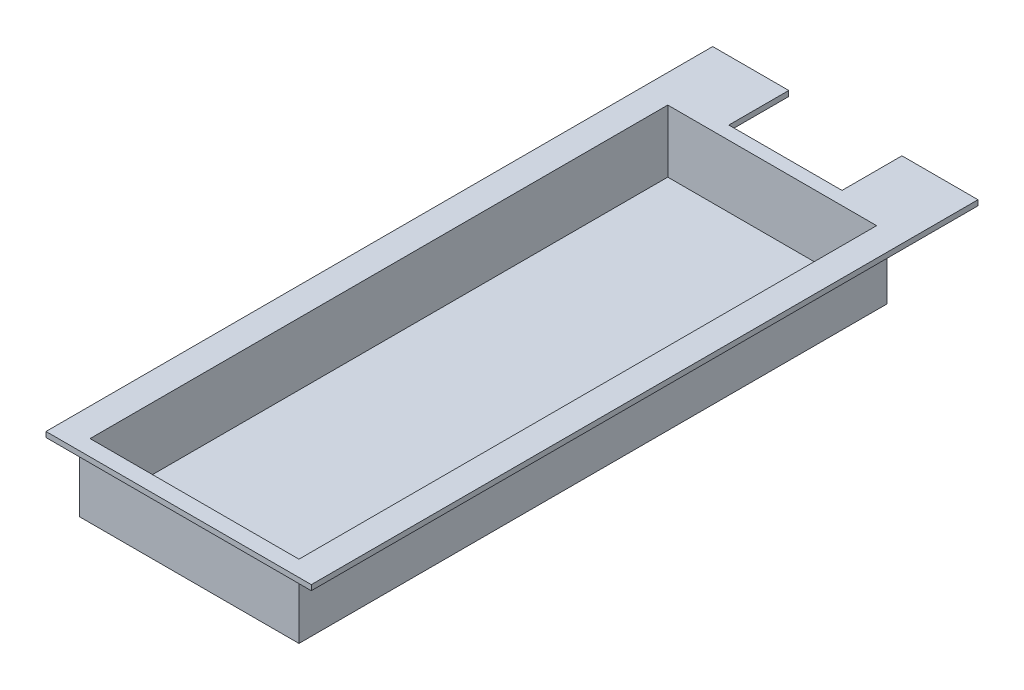
ISO-10303-21;
HEADER;
FILE_DESCRIPTION(('STEP AP214'),'2;1');
FILE_NAME('part.step','',(''),(''),'','','');
FILE_SCHEMA(('AUTOMOTIVE_DESIGN { 1 0 10303 214 1 1 1 1 }'));
ENDSEC;
DATA;
#1=APPLICATION_CONTEXT('core data for automotive mechanical design processes');
#2=APPLICATION_PROTOCOL_DEFINITION('international standard','automotive_design',2000,#1);
#3=PRODUCT_CONTEXT('',#1,'mechanical');
#4=PRODUCT('Part','Part','',(#3));
#5=PRODUCT_RELATED_PRODUCT_CATEGORY('part','',(#4));
#6=PRODUCT_DEFINITION_FORMATION('','',#4);
#7=PRODUCT_DEFINITION_CONTEXT('part definition',#1,'design');
#8=PRODUCT_DEFINITION('design','',#6,#7);
#9=PRODUCT_DEFINITION_SHAPE('','',#8);
#10=(LENGTH_UNIT() NAMED_UNIT(*) SI_UNIT(.MILLI.,.METRE.));
#11=(NAMED_UNIT(*) PLANE_ANGLE_UNIT() SI_UNIT($,.RADIAN.));
#12=(NAMED_UNIT(*) SI_UNIT($,.STERADIAN.) SOLID_ANGLE_UNIT());
#13=UNCERTAINTY_MEASURE_WITH_UNIT(LENGTH_MEASURE(1.E-05),#10,'distance_accuracy_value','');
#14=(GEOMETRIC_REPRESENTATION_CONTEXT(3) GLOBAL_UNCERTAINTY_ASSIGNED_CONTEXT((#13)) GLOBAL_UNIT_ASSIGNED_CONTEXT((#10,
#11,#12)) REPRESENTATION_CONTEXT('',''));
#15=CARTESIAN_POINT('',(0.,0.,0.));
#16=DIRECTION('',(0.,0.,1.));
#17=DIRECTION('',(1.,0.,0.));
#18=AXIS2_PLACEMENT_3D('',#15,#16,#17);
#19=CARTESIAN_POINT('',(0.,35.4,-118.746556797035));
#20=DIRECTION('',(0.,0.,-1.));
#21=DIRECTION('',(-1.,0.,0.));
#22=AXIS2_PLACEMENT_3D('',#19,#20,#21);
#23=PLANE('',#22);
#24=DIRECTION('',(1.,0.,0.));
#25=VECTOR('',#24,1.);
#26=CARTESIAN_POINT('',(0.,0.,-118.746556797035));
#27=LINE('',#26,#25);
#28=CARTESIAN_POINT('',(66.8696460176992,0.,-118.746556797035));
#29=VERTEX_POINT('',#28);
#30=CARTESIAN_POINT('',(185.329646017699,0.,-118.746556797035));
#31=VERTEX_POINT('',#30);
#32=EDGE_CURVE('E230',#29,#31,#27,.T.);
#33=ORIENTED_EDGE('',*,*,#32,.T.);
#34=DIRECTION('',(0.,-1.,0.));
#35=VECTOR('',#34,1.);
#36=CARTESIAN_POINT('',(185.329646017699,35.4,-118.746556797035));
#37=LINE('',#36,#35);
#38=CARTESIAN_POINT('',(185.329646017699,35.4,-118.746556797035));
#39=VERTEX_POINT('',#38);
#40=EDGE_CURVE('E270',#39,#31,#37,.T.);
#41=ORIENTED_EDGE('',*,*,#40,.F.);
#42=DIRECTION('',(1.,0.,0.));
#43=VECTOR('',#42,1.);
#44=CARTESIAN_POINT('',(0.,35.4,-118.746556797035));
#45=LINE('',#44,#43);
#46=CARTESIAN_POINT('',(66.8696460176992,35.4,-118.746556797035));
#47=VERTEX_POINT('',#46);
#48=EDGE_CURVE('E243',#47,#39,#45,.T.);
#49=ORIENTED_EDGE('',*,*,#48,.F.);
#50=DIRECTION('',(0.,-1.,0.));
#51=VECTOR('',#50,1.);
#52=CARTESIAN_POINT('',(66.8696460176992,35.4,-118.746556797035));
#53=LINE('',#52,#51);
#54=EDGE_CURVE('E255',#47,#29,#53,.T.);
#55=ORIENTED_EDGE('',*,*,#54,.T.);
#56=EDGE_LOOP('',(#33,#41,#49,#55));
#57=FACE_BOUND('',#56,.T.);
#58=ADVANCED_FACE('F47',(#57),#23,.F.);
#59=CARTESIAN_POINT('',(185.329646017699,35.4,0.));
#60=DIRECTION('',(1.,0.,0.));
#61=DIRECTION('',(0.,0.,-1.));
#62=AXIS2_PLACEMENT_3D('',#59,#60,#61);
#63=PLANE('',#62);
#64=DIRECTION('',(0.,0.,1.));
#65=VECTOR('',#64,1.);
#66=CARTESIAN_POINT('',(185.329646017699,0.,0.));
#67=LINE('',#66,#65);
#68=CARTESIAN_POINT('',(185.329646017699,0.,208.87348694907));
#69=VERTEX_POINT('',#68);
#70=EDGE_CURVE('E72',#31,#69,#67,.T.);
#71=ORIENTED_EDGE('',*,*,#70,.T.);
#72=DIRECTION('',(0.,-1.,0.));
#73=VECTOR('',#72,1.);
#74=CARTESIAN_POINT('',(185.329646017699,35.4,208.87348694907));
#75=LINE('',#74,#73);
#76=CARTESIAN_POINT('',(185.329646017699,35.4,208.87348694907));
#77=VERTEX_POINT('',#76);
#78=EDGE_CURVE('E267',#77,#69,#75,.T.);
#79=ORIENTED_EDGE('',*,*,#78,.F.);
#80=DIRECTION('',(0.,0.,1.));
#81=VECTOR('',#80,1.);
#82=CARTESIAN_POINT('',(185.329646017699,35.4,0.));
#83=LINE('',#82,#81);
#84=EDGE_CURVE('E246',#39,#77,#83,.T.);
#85=ORIENTED_EDGE('',*,*,#84,.F.);
#86=ORIENTED_EDGE('',*,*,#40,.T.);
#87=EDGE_LOOP('',(#71,#79,#85,#86));
#88=FACE_BOUND('',#87,.T.);
#89=ADVANCED_FACE('F312',(#88),#63,.F.);
#90=CARTESIAN_POINT('',(0.,35.4,208.87348694907));
#91=DIRECTION('',(0.,0.,-1.));
#92=DIRECTION('',(-1.,0.,0.));
#93=AXIS2_PLACEMENT_3D('',#90,#91,#92);
#94=PLANE('',#93);
#95=DIRECTION('',(1.,0.,0.));
#96=VECTOR('',#95,1.);
#97=CARTESIAN_POINT('',(0.,0.,208.87348694907));
#98=LINE('',#97,#96);
#99=CARTESIAN_POINT('',(66.8696460176992,0.,208.87348694907));
#100=VERTEX_POINT('',#99);
#101=EDGE_CURVE('E259',#100,#69,#98,.T.);
#102=ORIENTED_EDGE('',*,*,#101,.F.);
#103=DIRECTION('',(0.,-1.,0.));
#104=VECTOR('',#103,1.);
#105=CARTESIAN_POINT('',(66.8696460176992,35.4,208.87348694907));
#106=LINE('',#105,#104);
#107=CARTESIAN_POINT('',(66.8696460176992,35.4,208.87348694907));
#108=VERTEX_POINT('',#107);
#109=EDGE_CURVE('E264',#108,#100,#106,.T.);
#110=ORIENTED_EDGE('',*,*,#109,.F.);
#111=DIRECTION('',(1.,0.,0.));
#112=VECTOR('',#111,1.);
#113=CARTESIAN_POINT('',(0.,35.4,208.87348694907));
#114=LINE('',#113,#112);
#115=EDGE_CURVE('E249',#108,#77,#114,.T.);
#116=ORIENTED_EDGE('',*,*,#115,.T.);
#117=ORIENTED_EDGE('',*,*,#78,.T.);
#118=EDGE_LOOP('',(#102,#110,#116,#117));
#119=FACE_BOUND('',#118,.T.);
#120=ADVANCED_FACE('F319',(#119),#94,.T.);
#121=CARTESIAN_POINT('',(66.8696460176992,35.4,0.));
#122=DIRECTION('',(1.,0.,0.));
#123=DIRECTION('',(0.,0.,-1.));
#124=AXIS2_PLACEMENT_3D('',#121,#122,#123);
#125=PLANE('',#124);
#126=DIRECTION('',(0.,0.,1.));
#127=VECTOR('',#126,1.);
#128=CARTESIAN_POINT('',(66.8696460176992,0.,0.));
#129=LINE('',#128,#127);
#130=EDGE_CURVE('E247',#29,#100,#129,.T.);
#131=ORIENTED_EDGE('',*,*,#130,.F.);
#132=ORIENTED_EDGE('',*,*,#54,.F.);
#133=DIRECTION('',(0.,0.,1.));
#134=VECTOR('',#133,1.);
#135=CARTESIAN_POINT('',(66.8696460176992,35.4,0.));
#136=LINE('',#135,#134);
#137=EDGE_CURVE('E252',#47,#108,#136,.T.);
#138=ORIENTED_EDGE('',*,*,#137,.T.);
#139=ORIENTED_EDGE('',*,*,#109,.T.);
#140=EDGE_LOOP('',(#131,#132,#138,#139));
#141=FACE_BOUND('',#140,.T.);
#142=ADVANCED_FACE('F334',(#141),#125,.T.);
#143=CARTESIAN_POINT('',(0.,35.4,0.));
#144=DIRECTION('',(0.,1.,0.));
#145=DIRECTION('',(0.,0.,1.));
#146=AXIS2_PLACEMENT_3D('',#143,#144,#145);
#147=PLANE('',#146);
#148=ORIENTED_EDGE('',*,*,#48,.T.);
#149=ORIENTED_EDGE('',*,*,#84,.T.);
#150=ORIENTED_EDGE('',*,*,#115,.F.);
#151=ORIENTED_EDGE('',*,*,#137,.F.);
#152=EDGE_LOOP('',(#148,#149,#150,#151));
#153=FACE_BOUND('',#152,.T.);
#154=DIRECTION('',(0.,0.,1.));
#155=VECTOR('',#154,1.);
#156=CARTESIAN_POINT('',(201.329646017699,35.4,0.));
#157=LINE('',#156,#155);
#158=CARTESIAN_POINT('',(201.329646017699,35.4,-160.232979164548));
#159=VERTEX_POINT('',#158);
#160=CARTESIAN_POINT('',(201.329646017699,35.4,217.87348694907));
#161=VERTEX_POINT('',#160);
#162=EDGE_CURVE('E213',#159,#161,#157,.T.);
#163=ORIENTED_EDGE('',*,*,#162,.F.);
#164=DIRECTION('',(1.,0.,0.));
#165=VECTOR('',#164,1.);
#166=CARTESIAN_POINT('',(0.,35.4,-160.232979164548));
#167=LINE('',#166,#165);
#168=CARTESIAN_POINT('',(158.199646017699,35.4,-160.232979164548));
#169=VERTEX_POINT('',#168);
#170=EDGE_CURVE('E178',#169,#159,#167,.T.);
#171=ORIENTED_EDGE('',*,*,#170,.F.);
#172=DIRECTION('',(0.,0.,1.));
#173=VECTOR('',#172,1.);
#174=CARTESIAN_POINT('',(158.199646017699,35.4,0.));
#175=LINE('',#174,#173);
#176=CARTESIAN_POINT('',(158.199646017699,35.4,-126.246556797035));
#177=VERTEX_POINT('',#176);
#178=EDGE_CURVE('E216',#169,#177,#175,.T.);
#179=ORIENTED_EDGE('',*,*,#178,.T.);
#180=DIRECTION('',(-1.,0.,0.));
#181=VECTOR('',#180,1.);
#182=CARTESIAN_POINT('',(0.,35.4,-126.246556797035));
#183=LINE('',#182,#181);
#184=CARTESIAN_POINT('',(93.9996460176992,35.4,-126.246556797035));
#185=VERTEX_POINT('',#184);
#186=EDGE_CURVE('E219',#177,#185,#183,.T.);
#187=ORIENTED_EDGE('',*,*,#186,.T.);
#188=DIRECTION('',(0.,0.,1.));
#189=VECTOR('',#188,1.);
#190=CARTESIAN_POINT('',(93.999646017699,35.4,0.));
#191=LINE('',#190,#189);
#192=CARTESIAN_POINT('',(93.9996460176992,35.4,-160.232979164548));
#193=VERTEX_POINT('',#192);
#194=EDGE_CURVE('E222',#193,#185,#191,.T.);
#195=ORIENTED_EDGE('',*,*,#194,.F.);
#196=DIRECTION('',(1.,0.,0.));
#197=VECTOR('',#196,1.);
#198=CARTESIAN_POINT('',(0.,35.4,-160.232979164548));
#199=LINE('',#198,#197);
#200=CARTESIAN_POINT('',(50.8696460176992,35.4,-160.232979164548));
#201=VERTEX_POINT('',#200);
#202=EDGE_CURVE('E225',#201,#193,#199,.T.);
#203=ORIENTED_EDGE('',*,*,#202,.F.);
#204=DIRECTION('',(0.,0.,1.));
#205=VECTOR('',#204,1.);
#206=CARTESIAN_POINT('',(50.8696460176992,35.4,0.));
#207=LINE('',#206,#205);
#208=CARTESIAN_POINT('',(50.8696460176992,35.4,217.87348694907));
#209=VERTEX_POINT('',#208);
#210=EDGE_CURVE('E190',#201,#209,#207,.T.);
#211=ORIENTED_EDGE('',*,*,#210,.T.);
#212=DIRECTION('',(1.,0.,0.));
#213=VECTOR('',#212,1.);
#214=CARTESIAN_POINT('',(0.,35.4,217.87348694907));
#215=LINE('',#214,#213);
#216=EDGE_CURVE('E187',#209,#161,#215,.T.);
#217=ORIENTED_EDGE('',*,*,#216,.T.);
#218=EDGE_LOOP('',(#163,#171,#179,#187,#195,#203,#211,#217));
#219=FACE_BOUND('',#218,.T.);
#220=ADVANCED_FACE('F326',(#153,#219),#147,.T.);
#221=CARTESIAN_POINT('',(0.,0.,0.));
#222=DIRECTION('',(0.,1.,0.));
#223=DIRECTION('',(0.,0.,1.));
#224=AXIS2_PLACEMENT_3D('',#221,#222,#223);
#225=PLANE('',#224);
#226=ORIENTED_EDGE('',*,*,#70,.F.);
#227=ORIENTED_EDGE('',*,*,#32,.F.);
#228=ORIENTED_EDGE('',*,*,#130,.T.);
#229=ORIENTED_EDGE('',*,*,#101,.T.);
#230=EDGE_LOOP('',(#226,#227,#228,#229));
#231=FACE_BOUND('',#230,.T.);
#232=ADVANCED_FACE('F324',(#231),#225,.T.);
#233=CARTESIAN_POINT('',(201.329646017699,32.4,0.));
#234=DIRECTION('',(-1.,0.,0.));
#235=DIRECTION('',(0.,0.,1.));
#236=AXIS2_PLACEMENT_3D('',#233,#234,#235);
#237=PLANE('',#236);
#238=ORIENTED_EDGE('',*,*,#162,.T.);
#239=DIRECTION('',(0.,1.,0.));
#240=VECTOR('',#239,1.);
#241=CARTESIAN_POINT('',(201.329646017699,32.4,217.87348694907));
#242=LINE('',#241,#240);
#243=CARTESIAN_POINT('',(201.329646017699,32.4,217.87348694907));
#244=VERTEX_POINT('',#243);
#245=EDGE_CURVE('E185',#244,#161,#242,.T.);
#246=ORIENTED_EDGE('',*,*,#245,.F.);
#247=DIRECTION('',(0.,0.,1.));
#248=VECTOR('',#247,1.);
#249=CARTESIAN_POINT('',(201.329646017699,32.4,0.));
#250=LINE('',#249,#248);
#251=CARTESIAN_POINT('',(201.329646017699,32.4,-160.232979164548));
#252=VERTEX_POINT('',#251);
#253=EDGE_CURVE('E167',#252,#244,#250,.T.);
#254=ORIENTED_EDGE('',*,*,#253,.F.);
#255=DIRECTION('',(0.,1.,0.));
#256=VECTOR('',#255,1.);
#257=CARTESIAN_POINT('',(201.329646017699,32.4,-160.232979164548));
#258=LINE('',#257,#256);
#259=EDGE_CURVE('E175',#252,#159,#258,.T.);
#260=ORIENTED_EDGE('',*,*,#259,.T.);
#261=EDGE_LOOP('',(#238,#246,#254,#260));
#262=FACE_BOUND('',#261,.T.);
#263=ADVANCED_FACE('F184',(#262),#237,.F.);
#264=CARTESIAN_POINT('',(0.,32.4,217.87348694907));
#265=DIRECTION('',(0.,0.,1.));
#266=DIRECTION('',(1.,0.,0.));
#267=AXIS2_PLACEMENT_3D('',#264,#265,#266);
#268=PLANE('',#267);
#269=ORIENTED_EDGE('',*,*,#216,.F.);
#270=DIRECTION('',(0.,1.,0.));
#271=VECTOR('',#270,1.);
#272=CARTESIAN_POINT('',(50.8696460176992,32.4,217.87348694907));
#273=LINE('',#272,#271);
#274=CARTESIAN_POINT('',(50.8696460176992,32.4,217.87348694907));
#275=VERTEX_POINT('',#274);
#276=EDGE_CURVE('E231',#275,#209,#273,.T.);
#277=ORIENTED_EDGE('',*,*,#276,.F.);
#278=DIRECTION('',(1.,0.,0.));
#279=VECTOR('',#278,1.);
#280=CARTESIAN_POINT('',(0.,32.4,217.87348694907));
#281=LINE('',#280,#279);
#282=EDGE_CURVE('E204',#275,#244,#281,.T.);
#283=ORIENTED_EDGE('',*,*,#282,.T.);
#284=ORIENTED_EDGE('',*,*,#245,.T.);
#285=EDGE_LOOP('',(#269,#277,#283,#284));
#286=FACE_BOUND('',#285,.T.);
#287=ADVANCED_FACE('F332',(#286),#268,.T.);
#288=CARTESIAN_POINT('',(50.8696460176992,32.4,0.));
#289=DIRECTION('',(-1.,0.,0.));
#290=DIRECTION('',(0.,0.,1.));
#291=AXIS2_PLACEMENT_3D('',#288,#289,#290);
#292=PLANE('',#291);
#293=ORIENTED_EDGE('',*,*,#210,.F.);
#294=DIRECTION('',(0.,1.,0.));
#295=VECTOR('',#294,1.);
#296=CARTESIAN_POINT('',(50.8696460176992,32.4,-160.232979164548));
#297=LINE('',#296,#295);
#298=CARTESIAN_POINT('',(50.8696460176992,32.4,-160.232979164548));
#299=VERTEX_POINT('',#298);
#300=EDGE_CURVE('E233',#299,#201,#297,.T.);
#301=ORIENTED_EDGE('',*,*,#300,.F.);
#302=DIRECTION('',(0.,0.,1.));
#303=VECTOR('',#302,1.);
#304=CARTESIAN_POINT('',(50.8696460176992,32.4,0.));
#305=LINE('',#304,#303);
#306=EDGE_CURVE('E201',#299,#275,#305,.T.);
#307=ORIENTED_EDGE('',*,*,#306,.T.);
#308=ORIENTED_EDGE('',*,*,#276,.T.);
#309=EDGE_LOOP('',(#293,#301,#307,#308));
#310=FACE_BOUND('',#309,.T.);
#311=ADVANCED_FACE('F440',(#310),#292,.T.);
#312=CARTESIAN_POINT('',(0.,32.4,-160.232979164548));
#313=DIRECTION('',(0.,0.,1.));
#314=DIRECTION('',(1.,0.,0.));
#315=AXIS2_PLACEMENT_3D('',#312,#313,#314);
#316=PLANE('',#315);
#317=ORIENTED_EDGE('',*,*,#202,.T.);
#318=DIRECTION('',(0.,1.,0.));
#319=VECTOR('',#318,1.);
#320=CARTESIAN_POINT('',(93.9996460176992,32.4,-160.232979164548));
#321=LINE('',#320,#319);
#322=CARTESIAN_POINT('',(93.9996460176992,32.4,-160.232979164548));
#323=VERTEX_POINT('',#322);
#324=EDGE_CURVE('E235',#323,#193,#321,.T.);
#325=ORIENTED_EDGE('',*,*,#324,.F.);
#326=DIRECTION('',(1.,0.,0.));
#327=VECTOR('',#326,1.);
#328=CARTESIAN_POINT('',(0.,32.4,-160.232979164548));
#329=LINE('',#328,#327);
#330=EDGE_CURVE('E199',#299,#323,#329,.T.);
#331=ORIENTED_EDGE('',*,*,#330,.F.);
#332=ORIENTED_EDGE('',*,*,#300,.T.);
#333=EDGE_LOOP('',(#317,#325,#331,#332));
#334=FACE_BOUND('',#333,.T.);
#335=ADVANCED_FACE('F450',(#334),#316,.F.);
#336=CARTESIAN_POINT('',(93.999646017699,32.4,0.));
#337=DIRECTION('',(-1.,0.,0.));
#338=DIRECTION('',(0.,0.,1.));
#339=AXIS2_PLACEMENT_3D('',#336,#337,#338);
#340=PLANE('',#339);
#341=ORIENTED_EDGE('',*,*,#194,.T.);
#342=DIRECTION('',(0.,1.,0.));
#343=VECTOR('',#342,1.);
#344=CARTESIAN_POINT('',(93.9996460176992,32.4,-126.246556797035));
#345=LINE('',#344,#343);
#346=CARTESIAN_POINT('',(93.9996460176992,32.4,-126.246556797035));
#347=VERTEX_POINT('',#346);
#348=EDGE_CURVE('E238',#347,#185,#345,.T.);
#349=ORIENTED_EDGE('',*,*,#348,.F.);
#350=DIRECTION('',(0.,0.,1.));
#351=VECTOR('',#350,1.);
#352=CARTESIAN_POINT('',(93.999646017699,32.4,0.));
#353=LINE('',#352,#351);
#354=EDGE_CURVE('E197',#323,#347,#353,.T.);
#355=ORIENTED_EDGE('',*,*,#354,.F.);
#356=ORIENTED_EDGE('',*,*,#324,.T.);
#357=EDGE_LOOP('',(#341,#349,#355,#356));
#358=FACE_BOUND('',#357,.T.);
#359=ADVANCED_FACE('F460',(#358),#340,.F.);
#360=CARTESIAN_POINT('',(0.,32.4,-126.246556797035));
#361=DIRECTION('',(0.,0.,-1.));
#362=DIRECTION('',(-1.,0.,0.));
#363=AXIS2_PLACEMENT_3D('',#360,#361,#362);
#364=PLANE('',#363);
#365=ORIENTED_EDGE('',*,*,#186,.F.);
#366=DIRECTION('',(0.,1.,0.));
#367=VECTOR('',#366,1.);
#368=CARTESIAN_POINT('',(158.199646017699,32.4,-126.246556797035));
#369=LINE('',#368,#367);
#370=CARTESIAN_POINT('',(158.199646017699,32.4,-126.246556797035));
#371=VERTEX_POINT('',#370);
#372=EDGE_CURVE('E240',#371,#177,#369,.T.);
#373=ORIENTED_EDGE('',*,*,#372,.F.);
#374=DIRECTION('',(-1.,0.,0.));
#375=VECTOR('',#374,1.);
#376=CARTESIAN_POINT('',(0.,32.4,-126.246556797035));
#377=LINE('',#376,#375);
#378=EDGE_CURVE('E194',#371,#347,#377,.T.);
#379=ORIENTED_EDGE('',*,*,#378,.T.);
#380=ORIENTED_EDGE('',*,*,#348,.T.);
#381=EDGE_LOOP('',(#365,#373,#379,#380));
#382=FACE_BOUND('',#381,.T.);
#383=ADVANCED_FACE('F470',(#382),#364,.T.);
#384=CARTESIAN_POINT('',(158.199646017699,32.4,0.));
#385=DIRECTION('',(-1.,0.,0.));
#386=DIRECTION('',(0.,0.,1.));
#387=AXIS2_PLACEMENT_3D('',#384,#385,#386);
#388=PLANE('',#387);
#389=ORIENTED_EDGE('',*,*,#178,.F.);
#390=DIRECTION('',(0.,1.,0.));
#391=VECTOR('',#390,1.);
#392=CARTESIAN_POINT('',(158.199646017699,32.4,-160.232979164548));
#393=LINE('',#392,#391);
#394=CARTESIAN_POINT('',(158.199646017699,32.4,-160.232979164548));
#395=VERTEX_POINT('',#394);
#396=EDGE_CURVE('E182',#395,#169,#393,.T.);
#397=ORIENTED_EDGE('',*,*,#396,.F.);
#398=DIRECTION('',(0.,0.,1.));
#399=VECTOR('',#398,1.);
#400=CARTESIAN_POINT('',(158.199646017699,32.4,0.));
#401=LINE('',#400,#399);
#402=EDGE_CURVE('E171',#395,#371,#401,.T.);
#403=ORIENTED_EDGE('',*,*,#402,.T.);
#404=ORIENTED_EDGE('',*,*,#372,.T.);
#405=EDGE_LOOP('',(#389,#397,#403,#404));
#406=FACE_BOUND('',#405,.T.);
#407=ADVANCED_FACE('F481',(#406),#388,.T.);
#408=CARTESIAN_POINT('',(0.,32.4,-160.232979164548));
#409=DIRECTION('',(0.,0.,1.));
#410=DIRECTION('',(1.,0.,0.));
#411=AXIS2_PLACEMENT_3D('',#408,#409,#410);
#412=PLANE('',#411);
#413=ORIENTED_EDGE('',*,*,#170,.T.);
#414=ORIENTED_EDGE('',*,*,#259,.F.);
#415=DIRECTION('',(1.,0.,0.));
#416=VECTOR('',#415,1.);
#417=CARTESIAN_POINT('',(0.,32.4,-160.232979164548));
#418=LINE('',#417,#416);
#419=EDGE_CURVE('E162',#395,#252,#418,.T.);
#420=ORIENTED_EDGE('',*,*,#419,.F.);
#421=ORIENTED_EDGE('',*,*,#396,.T.);
#422=EDGE_LOOP('',(#413,#414,#420,#421));
#423=FACE_BOUND('',#422,.T.);
#424=ADVANCED_FACE('F176',(#423),#412,.F.);
#425=CARTESIAN_POINT('',(0.,32.4,0.));
#426=DIRECTION('',(0.,1.,0.));
#427=DIRECTION('',(0.,0.,1.));
#428=AXIS2_PLACEMENT_3D('',#425,#426,#427);
#429=PLANE('',#428);
#430=ORIENTED_EDGE('',*,*,#253,.T.);
#431=ORIENTED_EDGE('',*,*,#282,.F.);
#432=ORIENTED_EDGE('',*,*,#306,.F.);
#433=ORIENTED_EDGE('',*,*,#330,.T.);
#434=ORIENTED_EDGE('',*,*,#354,.T.);
#435=ORIENTED_EDGE('',*,*,#378,.F.);
#436=ORIENTED_EDGE('',*,*,#402,.F.);
#437=ORIENTED_EDGE('',*,*,#419,.T.);
#438=EDGE_LOOP('',(#430,#431,#432,#433,#434,#435,#436,#437));
#439=FACE_BOUND('',#438,.T.);
#440=DIRECTION('',(1.,0.,0.));
#441=VECTOR('',#440,1.);
#442=CARTESIAN_POINT('',(0.,32.4,211.87348694907));
#443=LINE('',#442,#441);
#444=CARTESIAN_POINT('',(63.8696460176992,32.4,211.87348694907));
#445=VERTEX_POINT('',#444);
#446=CARTESIAN_POINT('',(188.329646017699,32.4,211.87348694907));
#447=VERTEX_POINT('',#446);
#448=EDGE_CURVE('E206',#445,#447,#443,.T.);
#449=ORIENTED_EDGE('',*,*,#448,.T.);
#450=DIRECTION('',(0.,0.,-1.));
#451=VECTOR('',#450,1.);
#452=CARTESIAN_POINT('',(188.329646017699,32.4,0.));
#453=LINE('',#452,#451);
#454=CARTESIAN_POINT('',(188.329646017699,32.4,-121.746556797035));
#455=VERTEX_POINT('',#454);
#456=EDGE_CURVE('E64',#447,#455,#453,.T.);
#457=ORIENTED_EDGE('',*,*,#456,.T.);
#458=DIRECTION('',(1.,0.,0.));
#459=VECTOR('',#458,1.);
#460=CARTESIAN_POINT('',(0.,32.4,-121.746556797035));
#461=LINE('',#460,#459);
#462=CARTESIAN_POINT('',(63.8696460176992,32.4,-121.746556797035));
#463=VERTEX_POINT('',#462);
#464=EDGE_CURVE('E210',#463,#455,#461,.T.);
#465=ORIENTED_EDGE('',*,*,#464,.F.);
#466=DIRECTION('',(0.,0.,1.));
#467=VECTOR('',#466,1.);
#468=CARTESIAN_POINT('',(63.8696460176992,32.4,0.));
#469=LINE('',#468,#467);
#470=EDGE_CURVE('E208',#463,#445,#469,.T.);
#471=ORIENTED_EDGE('',*,*,#470,.T.);
#472=EDGE_LOOP('',(#449,#457,#465,#471));
#473=FACE_BOUND('',#472,.T.);
#474=ADVANCED_FACE('F164',(#439,#473),#429,.F.);
#475=CARTESIAN_POINT('',(0.,-3.,0.));
#476=DIRECTION('',(0.,1.,0.));
#477=DIRECTION('',(0.,0.,1.));
#478=AXIS2_PLACEMENT_3D('',#475,#476,#477);
#479=PLANE('',#478);
#480=DIRECTION('',(0.,0.,-1.));
#481=VECTOR('',#480,1.);
#482=CARTESIAN_POINT('',(188.329646017699,-3.,-121.746556797035));
#483=LINE('',#482,#481);
#484=CARTESIAN_POINT('',(188.329646017699,-3.,211.87348694907));
#485=VERTEX_POINT('',#484);
#486=CARTESIAN_POINT('',(188.329646017699,-3.,-121.746556797035));
#487=VERTEX_POINT('',#486);
#488=EDGE_CURVE('E272',#485,#487,#483,.T.);
#489=ORIENTED_EDGE('',*,*,#488,.F.);
#490=DIRECTION('',(1.,0.,0.));
#491=VECTOR('',#490,1.);
#492=CARTESIAN_POINT('',(63.8696460176992,-3.,211.87348694907));
#493=LINE('',#492,#491);
#494=CARTESIAN_POINT('',(63.8696460176992,-3.,211.87348694907));
#495=VERTEX_POINT('',#494);
#496=EDGE_CURVE('E280',#495,#485,#493,.T.);
#497=ORIENTED_EDGE('',*,*,#496,.F.);
#498=DIRECTION('',(0.,0.,1.));
#499=VECTOR('',#498,1.);
#500=CARTESIAN_POINT('',(63.8696460176992,-3.,-121.746556797035));
#501=LINE('',#500,#499);
#502=CARTESIAN_POINT('',(63.8696460176992,-3.,-121.746556797035));
#503=VERTEX_POINT('',#502);
#504=EDGE_CURVE('E277',#503,#495,#501,.T.);
#505=ORIENTED_EDGE('',*,*,#504,.F.);
#506=DIRECTION('',(-1.,0.,0.));
#507=VECTOR('',#506,1.);
#508=CARTESIAN_POINT('',(164.199646017699,-3.,-121.746556797035));
#509=LINE('',#508,#507);
#510=EDGE_CURVE('E275',#487,#503,#509,.T.);
#511=ORIENTED_EDGE('',*,*,#510,.F.);
#512=EDGE_LOOP('',(#489,#497,#505,#511));
#513=FACE_BOUND('',#512,.T.);
#514=ADVANCED_FACE('F295',(#513),#479,.F.);
#515=CARTESIAN_POINT('',(87.9996460176992,-3.,-121.746556797035));
#516=DIRECTION('',(0.,0.,-1.));
#517=DIRECTION('',(-1.,0.,0.));
#518=AXIS2_PLACEMENT_3D('',#515,#516,#517);
#519=PLANE('',#518);
#520=DIRECTION('',(0.,1.,0.));
#521=VECTOR('',#520,1.);
#522=CARTESIAN_POINT('',(63.8696460176992,-3.,-121.746556797035));
#523=LINE('',#522,#521);
#524=EDGE_CURVE('E284',#503,#463,#523,.T.);
#525=ORIENTED_EDGE('',*,*,#524,.T.);
#526=ORIENTED_EDGE('',*,*,#464,.T.);
#527=DIRECTION('',(0.,1.,0.));
#528=VECTOR('',#527,1.);
#529=CARTESIAN_POINT('',(188.329646017699,-3.,-121.746556797035));
#530=LINE('',#529,#528);
#531=EDGE_CURVE('E51',#487,#455,#530,.T.);
#532=ORIENTED_EDGE('',*,*,#531,.F.);
#533=ORIENTED_EDGE('',*,*,#510,.T.);
#534=EDGE_LOOP('',(#525,#526,#532,#533));
#535=FACE_BOUND('',#534,.T.);
#536=ADVANCED_FACE('F292',(#535),#519,.T.);
#537=CARTESIAN_POINT('',(63.8696460176992,-3.,-121.746556797035));
#538=DIRECTION('',(-1.,0.,0.));
#539=DIRECTION('',(0.,0.,1.));
#540=AXIS2_PLACEMENT_3D('',#537,#538,#539);
#541=PLANE('',#540);
#542=DIRECTION('',(0.,1.,0.));
#543=VECTOR('',#542,1.);
#544=CARTESIAN_POINT('',(63.8696460176992,-3.,211.87348694907));
#545=LINE('',#544,#543);
#546=EDGE_CURVE('E56',#495,#445,#545,.T.);
#547=ORIENTED_EDGE('',*,*,#546,.T.);
#548=ORIENTED_EDGE('',*,*,#470,.F.);
#549=ORIENTED_EDGE('',*,*,#524,.F.);
#550=ORIENTED_EDGE('',*,*,#504,.T.);
#551=EDGE_LOOP('',(#547,#548,#549,#550));
#552=FACE_BOUND('',#551,.T.);
#553=ADVANCED_FACE('F298',(#552),#541,.T.);
#554=CARTESIAN_POINT('',(63.8696460176992,-3.,211.87348694907));
#555=DIRECTION('',(0.,0.,1.));
#556=DIRECTION('',(1.,0.,0.));
#557=AXIS2_PLACEMENT_3D('',#554,#555,#556);
#558=PLANE('',#557);
#559=DIRECTION('',(0.,1.,0.));
#560=VECTOR('',#559,1.);
#561=CARTESIAN_POINT('',(188.329646017699,-3.,211.87348694907));
#562=LINE('',#561,#560);
#563=EDGE_CURVE('E11',#485,#447,#562,.T.);
#564=ORIENTED_EDGE('',*,*,#563,.T.);
#565=ORIENTED_EDGE('',*,*,#448,.F.);
#566=ORIENTED_EDGE('',*,*,#546,.F.);
#567=ORIENTED_EDGE('',*,*,#496,.T.);
#568=EDGE_LOOP('',(#564,#565,#566,#567));
#569=FACE_BOUND('',#568,.T.);
#570=ADVANCED_FACE('F302',(#569),#558,.T.);
#571=CARTESIAN_POINT('',(188.329646017699,-3.,-121.746556797035));
#572=DIRECTION('',(1.,0.,0.));
#573=DIRECTION('',(0.,0.,-1.));
#574=AXIS2_PLACEMENT_3D('',#571,#572,#573);
#575=PLANE('',#574);
#576=ORIENTED_EDGE('',*,*,#531,.T.);
#577=ORIENTED_EDGE('',*,*,#456,.F.);
#578=ORIENTED_EDGE('',*,*,#563,.F.);
#579=ORIENTED_EDGE('',*,*,#488,.T.);
#580=EDGE_LOOP('',(#576,#577,#578,#579));
#581=FACE_BOUND('',#580,.T.);
#582=ADVANCED_FACE('F49',(#581),#575,.T.);
#583=CLOSED_SHELL('',(#58,#89,#120,#142,#220,#232,#263,#287,#311,#335,#359,#383,#407,#424,#474,
#514,#536,#553,#570,#582));
#584=MANIFOLD_SOLID_BREP('B2',#583);
#585=ADVANCED_BREP_SHAPE_REPRESENTATION('',(#18,#584),#14);
#586=SHAPE_DEFINITION_REPRESENTATION(#9,#585);
ENDSEC;
END-ISO-10303-21;
